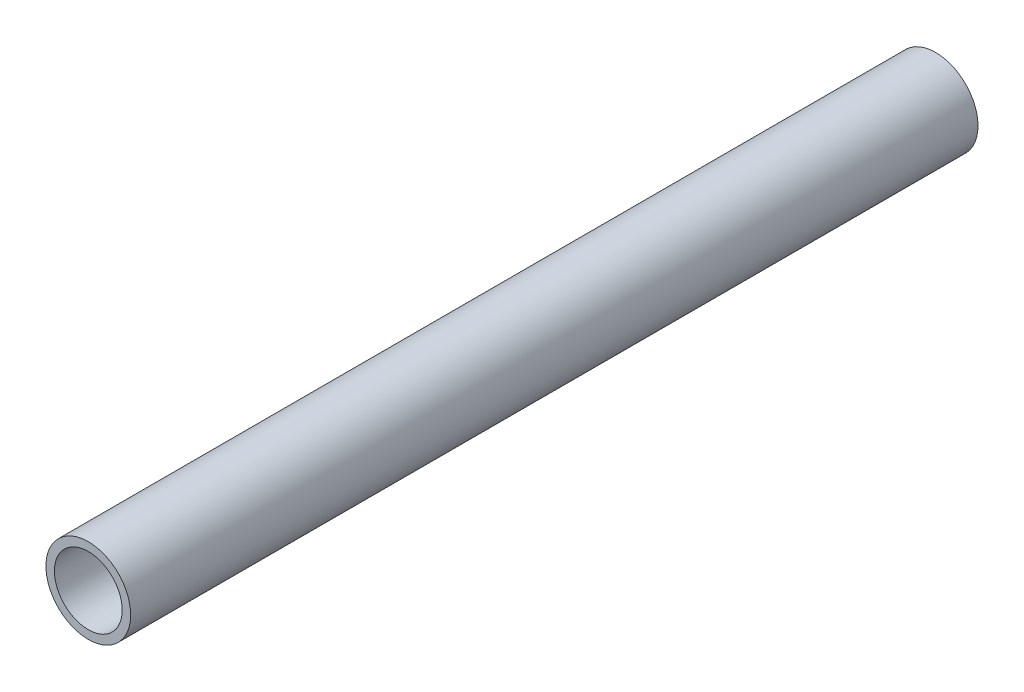
ISO-10303-21;
HEADER;
FILE_DESCRIPTION(('STEP AP214'),'2;1');
FILE_NAME('part.step','',(''),(''),'','','');
FILE_SCHEMA(('AUTOMOTIVE_DESIGN { 1 0 10303 214 1 1 1 1 }'));
ENDSEC;
DATA;
#1=APPLICATION_CONTEXT('core data for automotive mechanical design processes');
#2=APPLICATION_PROTOCOL_DEFINITION('international standard','automotive_design',2000,#1);
#3=PRODUCT_CONTEXT('',#1,'mechanical');
#4=PRODUCT('Part','Part','',(#3));
#5=PRODUCT_RELATED_PRODUCT_CATEGORY('part','',(#4));
#6=PRODUCT_DEFINITION_FORMATION('','',#4);
#7=PRODUCT_DEFINITION_CONTEXT('part definition',#1,'design');
#8=PRODUCT_DEFINITION('design','',#6,#7);
#9=PRODUCT_DEFINITION_SHAPE('','',#8);
#10=(LENGTH_UNIT() NAMED_UNIT(*) SI_UNIT(.MILLI.,.METRE.));
#11=(NAMED_UNIT(*) PLANE_ANGLE_UNIT() SI_UNIT($,.RADIAN.));
#12=(NAMED_UNIT(*) SI_UNIT($,.STERADIAN.) SOLID_ANGLE_UNIT());
#13=UNCERTAINTY_MEASURE_WITH_UNIT(LENGTH_MEASURE(1.E-05),#10,'distance_accuracy_value','');
#14=(GEOMETRIC_REPRESENTATION_CONTEXT(3) GLOBAL_UNCERTAINTY_ASSIGNED_CONTEXT((#13)) GLOBAL_UNIT_ASSIGNED_CONTEXT((#10,
#11,#12)) REPRESENTATION_CONTEXT('',''));
#15=CARTESIAN_POINT('',(0.,0.,0.));
#16=DIRECTION('',(0.,0.,1.));
#17=DIRECTION('',(1.,0.,0.));
#18=AXIS2_PLACEMENT_3D('',#15,#16,#17);
#19=CARTESIAN_POINT('',(0.,0.,200.));
#20=DIRECTION('',(0.,0.,1.));
#21=DIRECTION('',(1.,0.,0.));
#22=AXIS2_PLACEMENT_3D('',#19,#20,#21);
#23=PLANE('',#22);
#24=CARTESIAN_POINT('',(0.,0.,200.));
#25=DIRECTION('',(0.,0.,1.));
#26=DIRECTION('',(1.,0.,0.));
#27=AXIS2_PLACEMENT_3D('',#24,#25,#26);
#28=CIRCLE('',#27,10.);
#29=CARTESIAN_POINT('',(10.,0.,200.));
#30=VERTEX_POINT('',#29);
#31=EDGE_CURVE('E10',#30,#30,#28,.T.);
#32=ORIENTED_EDGE('',*,*,#31,.T.);
#33=EDGE_LOOP('',(#32));
#34=FACE_BOUND('',#33,.T.);
#35=CARTESIAN_POINT('',(0.,0.,200.));
#36=DIRECTION('',(0.,0.,1.));
#37=DIRECTION('',(1.,0.,0.));
#38=AXIS2_PLACEMENT_3D('',#35,#36,#37);
#39=CIRCLE('',#38,8.);
#40=CARTESIAN_POINT('',(8.,0.,200.));
#41=VERTEX_POINT('',#40);
#42=EDGE_CURVE('E40',#41,#41,#39,.T.);
#43=ORIENTED_EDGE('',*,*,#42,.F.);
#44=EDGE_LOOP('',(#43));
#45=FACE_BOUND('',#44,.T.);
#46=ADVANCED_FACE('F29',(#34,#45),#23,.T.);
#47=CARTESIAN_POINT('',(0.,0.,0.));
#48=DIRECTION('',(0.,0.,1.));
#49=DIRECTION('',(1.,0.,0.));
#50=AXIS2_PLACEMENT_3D('',#47,#48,#49);
#51=PLANE('',#50);
#52=CARTESIAN_POINT('',(0.,0.,0.));
#53=DIRECTION('',(0.,0.,1.));
#54=DIRECTION('',(1.,0.,0.));
#55=AXIS2_PLACEMENT_3D('',#52,#53,#54);
#56=CIRCLE('',#55,10.);
#57=CARTESIAN_POINT('',(10.,0.,0.));
#58=VERTEX_POINT('',#57);
#59=EDGE_CURVE('E33',#58,#58,#56,.T.);
#60=ORIENTED_EDGE('',*,*,#59,.F.);
#61=EDGE_LOOP('',(#60));
#62=FACE_BOUND('',#61,.T.);
#63=CARTESIAN_POINT('',(0.,0.,0.));
#64=DIRECTION('',(0.,0.,1.));
#65=DIRECTION('',(1.,0.,0.));
#66=AXIS2_PLACEMENT_3D('',#63,#64,#65);
#67=CIRCLE('',#66,8.);
#68=CARTESIAN_POINT('',(8.,0.,0.));
#69=VERTEX_POINT('',#68);
#70=EDGE_CURVE('E42',#69,#69,#67,.T.);
#71=ORIENTED_EDGE('',*,*,#70,.T.);
#72=EDGE_LOOP('',(#71));
#73=FACE_BOUND('',#72,.T.);
#74=ADVANCED_FACE('F52',(#62,#73),#51,.F.);
#75=CARTESIAN_POINT('',(0.,0.,200.));
#76=DIRECTION('',(0.,0.,-1.));
#77=DIRECTION('',(-1.,0.,0.));
#78=AXIS2_PLACEMENT_3D('',#75,#76,#77);
#79=CYLINDRICAL_SURFACE('',#78,10.);
#80=ORIENTED_EDGE('',*,*,#31,.F.);
#81=EDGE_LOOP('',(#80));
#82=FACE_BOUND('',#81,.T.);
#83=ORIENTED_EDGE('',*,*,#59,.T.);
#84=EDGE_LOOP('',(#83));
#85=FACE_BOUND('',#84,.T.);
#86=ADVANCED_FACE('F31',(#82,#85),#79,.T.);
#87=CARTESIAN_POINT('',(0.,0.,200.));
#88=DIRECTION('',(0.,0.,-1.));
#89=DIRECTION('',(-1.,0.,0.));
#90=AXIS2_PLACEMENT_3D('',#87,#88,#89);
#91=CYLINDRICAL_SURFACE('',#90,8.);
#92=ORIENTED_EDGE('',*,*,#42,.T.);
#93=EDGE_LOOP('',(#92));
#94=FACE_BOUND('',#93,.T.);
#95=ORIENTED_EDGE('',*,*,#70,.F.);
#96=EDGE_LOOP('',(#95));
#97=FACE_BOUND('',#96,.T.);
#98=ADVANCED_FACE('F48',(#94,#97),#91,.F.);
#99=CLOSED_SHELL('',(#46,#74,#86,#98));
#100=MANIFOLD_SOLID_BREP('B2',#99);
#101=ADVANCED_BREP_SHAPE_REPRESENTATION('',(#18,#100),#14);
#102=SHAPE_DEFINITION_REPRESENTATION(#9,#101);
ENDSEC;
END-ISO-10303-21;
